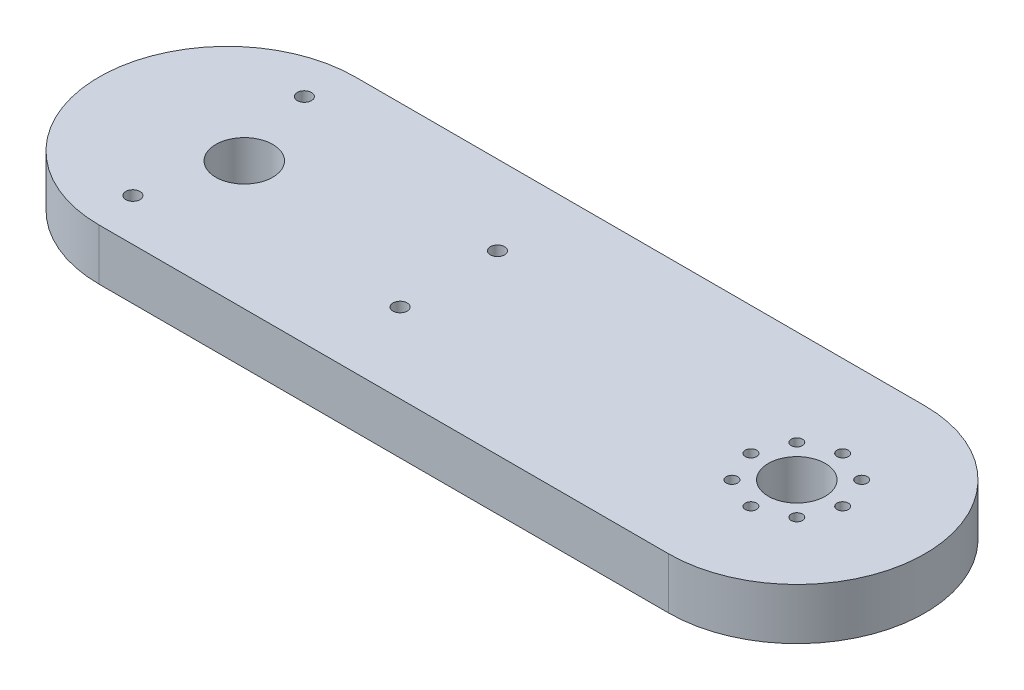
ISO-10303-21;
HEADER;
FILE_DESCRIPTION(('STEP AP214'),'2;1');
FILE_NAME('part.step','',(''),(''),'','','');
FILE_SCHEMA(('AUTOMOTIVE_DESIGN { 1 0 10303 214 1 1 1 1 }'));
ENDSEC;
DATA;
#1=APPLICATION_CONTEXT('core data for automotive mechanical design processes');
#2=APPLICATION_PROTOCOL_DEFINITION('international standard','automotive_design',2000,#1);
#3=PRODUCT_CONTEXT('',#1,'mechanical');
#4=PRODUCT('Part','Part','',(#3));
#5=PRODUCT_RELATED_PRODUCT_CATEGORY('part','',(#4));
#6=PRODUCT_DEFINITION_FORMATION('','',#4);
#7=PRODUCT_DEFINITION_CONTEXT('part definition',#1,'design');
#8=PRODUCT_DEFINITION('design','',#6,#7);
#9=PRODUCT_DEFINITION_SHAPE('','',#8);
#10=(LENGTH_UNIT() NAMED_UNIT(*) SI_UNIT(.MILLI.,.METRE.));
#11=(NAMED_UNIT(*) PLANE_ANGLE_UNIT() SI_UNIT($,.RADIAN.));
#12=(NAMED_UNIT(*) SI_UNIT($,.STERADIAN.) SOLID_ANGLE_UNIT());
#13=UNCERTAINTY_MEASURE_WITH_UNIT(LENGTH_MEASURE(1.E-05),#10,'distance_accuracy_value','');
#14=(GEOMETRIC_REPRESENTATION_CONTEXT(3) GLOBAL_UNCERTAINTY_ASSIGNED_CONTEXT((#13)) GLOBAL_UNIT_ASSIGNED_CONTEXT((#10,
#11,#12)) REPRESENTATION_CONTEXT('',''));
#15=CARTESIAN_POINT('',(0.,0.,0.));
#16=DIRECTION('',(0.,0.,1.));
#17=DIRECTION('',(1.,0.,0.));
#18=AXIS2_PLACEMENT_3D('',#15,#16,#17);
#19=CARTESIAN_POINT('',(50.,4.5,0.));
#20=DIRECTION('',(0.,-1.,0.));
#21=DIRECTION('',(0.,0.,-1.));
#22=AXIS2_PLACEMENT_3D('',#19,#20,#21);
#23=CYLINDRICAL_SURFACE('',#22,22.5);
#24=CARTESIAN_POINT('',(50.,-4.5,0.));
#25=DIRECTION('',(0.,1.,0.));
#26=DIRECTION('',(0.,0.,1.));
#27=AXIS2_PLACEMENT_3D('',#24,#25,#26);
#28=CIRCLE('',#27,22.5);
#29=CARTESIAN_POINT('',(50.,-4.5,22.5));
#30=VERTEX_POINT('',#29);
#31=CARTESIAN_POINT('',(50.,-4.5,-22.5));
#32=VERTEX_POINT('',#31);
#33=EDGE_CURVE('E99',#30,#32,#28,.T.);
#34=ORIENTED_EDGE('',*,*,#33,.T.);
#35=DIRECTION('',(0.,-1.,0.));
#36=VECTOR('',#35,1.);
#37=CARTESIAN_POINT('',(50.,4.5,-22.5));
#38=LINE('',#37,#36);
#39=CARTESIAN_POINT('',(50.,4.5,-22.5));
#40=VERTEX_POINT('',#39);
#41=EDGE_CURVE('E11',#40,#32,#38,.T.);
#42=ORIENTED_EDGE('',*,*,#41,.F.);
#43=CARTESIAN_POINT('',(50.,4.5,0.));
#44=DIRECTION('',(0.,1.,0.));
#45=DIRECTION('',(0.,0.,1.));
#46=AXIS2_PLACEMENT_3D('',#43,#44,#45);
#47=CIRCLE('',#46,22.5);
#48=CARTESIAN_POINT('',(50.,4.5,22.5));
#49=VERTEX_POINT('',#48);
#50=EDGE_CURVE('E87',#49,#40,#47,.T.);
#51=ORIENTED_EDGE('',*,*,#50,.F.);
#52=DIRECTION('',(0.,-1.,0.));
#53=VECTOR('',#52,1.);
#54=CARTESIAN_POINT('',(50.,4.5,22.5));
#55=LINE('',#54,#53);
#56=EDGE_CURVE('E95',#49,#30,#55,.T.);
#57=ORIENTED_EDGE('',*,*,#56,.T.);
#58=EDGE_LOOP('',(#34,#42,#51,#57));
#59=FACE_BOUND('',#58,.T.);
#60=ADVANCED_FACE('F36',(#59),#23,.T.);
#61=CARTESIAN_POINT('',(50.,4.5,-22.5));
#62=DIRECTION('',(0.,0.,1.));
#63=DIRECTION('',(1.,0.,0.));
#64=AXIS2_PLACEMENT_3D('',#61,#62,#63);
#65=PLANE('',#64);
#66=DIRECTION('',(-1.,0.,0.));
#67=VECTOR('',#66,1.);
#68=CARTESIAN_POINT('',(50.,-4.5,-22.5));
#69=LINE('',#68,#67);
#70=CARTESIAN_POINT('',(-50.,-4.5,-22.5));
#71=VERTEX_POINT('',#70);
#72=EDGE_CURVE('E91',#32,#71,#69,.T.);
#73=ORIENTED_EDGE('',*,*,#72,.T.);
#74=DIRECTION('',(0.,-1.,0.));
#75=VECTOR('',#74,1.);
#76=CARTESIAN_POINT('',(-50.,4.5,-22.5));
#77=LINE('',#76,#75);
#78=CARTESIAN_POINT('',(-50.,4.5,-22.5));
#79=VERTEX_POINT('',#78);
#80=EDGE_CURVE('E44',#79,#71,#77,.T.);
#81=ORIENTED_EDGE('',*,*,#80,.F.);
#82=DIRECTION('',(-1.,0.,0.));
#83=VECTOR('',#82,1.);
#84=CARTESIAN_POINT('',(50.,4.5,-22.5));
#85=LINE('',#84,#83);
#86=EDGE_CURVE('E82',#40,#79,#85,.T.);
#87=ORIENTED_EDGE('',*,*,#86,.F.);
#88=ORIENTED_EDGE('',*,*,#41,.T.);
#89=EDGE_LOOP('',(#73,#81,#87,#88));
#90=FACE_BOUND('',#89,.T.);
#91=ADVANCED_FACE('F90',(#90),#65,.F.);
#92=CARTESIAN_POINT('',(-50.,4.5,0.));
#93=DIRECTION('',(0.,-1.,0.));
#94=DIRECTION('',(0.,0.,-1.));
#95=AXIS2_PLACEMENT_3D('',#92,#93,#94);
#96=CYLINDRICAL_SURFACE('',#95,22.5);
#97=CARTESIAN_POINT('',(-50.,-4.5,0.));
#98=DIRECTION('',(0.,1.,0.));
#99=DIRECTION('',(0.,0.,1.));
#100=AXIS2_PLACEMENT_3D('',#97,#98,#99);
#101=CIRCLE('',#100,22.5);
#102=CARTESIAN_POINT('',(-50.,-4.5,22.5));
#103=VERTEX_POINT('',#102);
#104=EDGE_CURVE('E69',#71,#103,#101,.T.);
#105=ORIENTED_EDGE('',*,*,#104,.T.);
#106=DIRECTION('',(0.,-1.,0.));
#107=VECTOR('',#106,1.);
#108=CARTESIAN_POINT('',(-50.,4.5,22.5));
#109=LINE('',#108,#107);
#110=CARTESIAN_POINT('',(-50.,4.5,22.5));
#111=VERTEX_POINT('',#110);
#112=EDGE_CURVE('E92',#111,#103,#109,.T.);
#113=ORIENTED_EDGE('',*,*,#112,.F.);
#114=CARTESIAN_POINT('',(-50.,4.5,0.));
#115=DIRECTION('',(0.,1.,0.));
#116=DIRECTION('',(0.,0.,1.));
#117=AXIS2_PLACEMENT_3D('',#114,#115,#116);
#118=CIRCLE('',#117,22.5);
#119=EDGE_CURVE('E85',#79,#111,#118,.T.);
#120=ORIENTED_EDGE('',*,*,#119,.F.);
#121=ORIENTED_EDGE('',*,*,#80,.T.);
#122=EDGE_LOOP('',(#105,#113,#120,#121));
#123=FACE_BOUND('',#122,.T.);
#124=ADVANCED_FACE('F93',(#123),#96,.T.);
#125=CARTESIAN_POINT('',(50.,4.5,22.5));
#126=DIRECTION('',(0.,0.,-1.));
#127=DIRECTION('',(-1.,0.,0.));
#128=AXIS2_PLACEMENT_3D('',#125,#126,#127);
#129=PLANE('',#128);
#130=DIRECTION('',(1.,0.,0.));
#131=VECTOR('',#130,1.);
#132=CARTESIAN_POINT('',(50.,-4.5,22.5));
#133=LINE('',#132,#131);
#134=EDGE_CURVE('E75',#103,#30,#133,.T.);
#135=ORIENTED_EDGE('',*,*,#134,.T.);
#136=ORIENTED_EDGE('',*,*,#56,.F.);
#137=DIRECTION('',(1.,0.,0.));
#138=VECTOR('',#137,1.);
#139=CARTESIAN_POINT('',(50.,4.5,22.5));
#140=LINE('',#139,#138);
#141=EDGE_CURVE('E52',#111,#49,#140,.T.);
#142=ORIENTED_EDGE('',*,*,#141,.F.);
#143=ORIENTED_EDGE('',*,*,#112,.T.);
#144=EDGE_LOOP('',(#135,#136,#142,#143));
#145=FACE_BOUND('',#144,.T.);
#146=ADVANCED_FACE('F107',(#145),#129,.F.);
#147=CARTESIAN_POINT('',(50.,4.5,0.));
#148=DIRECTION('',(0.,1.,0.));
#149=DIRECTION('',(0.,0.,1.));
#150=AXIS2_PLACEMENT_3D('',#147,#148,#149);
#151=PLANE('',#150);
#152=CARTESIAN_POINT('',(-51.5,4.5,15.05));
#153=DIRECTION('',(0.,1.,0.));
#154=DIRECTION('',(0.,0.,1.));
#155=AXIS2_PLACEMENT_3D('',#152,#153,#154);
#156=CIRCLE('',#155,1.25);
#157=CARTESIAN_POINT('',(-51.5,4.5,16.3));
#158=VERTEX_POINT('',#157);
#159=EDGE_CURVE('E164',#158,#158,#156,.T.);
#160=ORIENTED_EDGE('',*,*,#159,.F.);
#161=EDGE_LOOP('',(#160));
#162=FACE_BOUND('',#161,.T.);
#163=CARTESIAN_POINT('',(-47.,4.5,0.));
#164=DIRECTION('',(0.,1.,0.));
#165=DIRECTION('',(0.,0.,1.));
#166=AXIS2_PLACEMENT_3D('',#163,#164,#165);
#167=CIRCLE('',#166,5.);
#168=CARTESIAN_POINT('',(-47.,4.5,5.));
#169=VERTEX_POINT('',#168);
#170=EDGE_CURVE('E169',#169,#169,#167,.T.);
#171=ORIENTED_EDGE('',*,*,#170,.F.);
#172=EDGE_LOOP('',(#171));
#173=FACE_BOUND('',#172,.T.);
#174=CARTESIAN_POINT('',(-11.1,4.5,-8.55));
#175=DIRECTION('',(0.,1.,0.));
#176=DIRECTION('',(0.,0.,1.));
#177=AXIS2_PLACEMENT_3D('',#174,#175,#176);
#178=CIRCLE('',#177,1.25);
#179=CARTESIAN_POINT('',(-11.1,4.5,-7.3));
#180=VERTEX_POINT('',#179);
#181=EDGE_CURVE('E172',#180,#180,#178,.T.);
#182=ORIENTED_EDGE('',*,*,#181,.F.);
#183=EDGE_LOOP('',(#182));
#184=FACE_BOUND('',#183,.T.);
#185=CARTESIAN_POINT('',(-11.1,4.5,8.55));
#186=DIRECTION('',(0.,1.,0.));
#187=DIRECTION('',(0.,0.,1.));
#188=AXIS2_PLACEMENT_3D('',#185,#186,#187);
#189=CIRCLE('',#188,1.25);
#190=CARTESIAN_POINT('',(-11.1,4.5,9.8));
#191=VERTEX_POINT('',#190);
#192=EDGE_CURVE('E175',#191,#191,#189,.T.);
#193=ORIENTED_EDGE('',*,*,#192,.F.);
#194=EDGE_LOOP('',(#193));
#195=FACE_BOUND('',#194,.T.);
#196=CARTESIAN_POINT('',(-51.5,4.5,-15.05));
#197=DIRECTION('',(0.,1.,0.));
#198=DIRECTION('',(0.,0.,1.));
#199=AXIS2_PLACEMENT_3D('',#196,#197,#198);
#200=CIRCLE('',#199,1.25);
#201=CARTESIAN_POINT('',(-51.5,4.5,-13.8));
#202=VERTEX_POINT('',#201);
#203=EDGE_CURVE('E178',#202,#202,#200,.T.);
#204=ORIENTED_EDGE('',*,*,#203,.F.);
#205=EDGE_LOOP('',(#204));
#206=FACE_BOUND('',#205,.T.);
#207=CARTESIAN_POINT('',(50.,4.5,0.));
#208=DIRECTION('',(0.,1.,0.));
#209=DIRECTION('',(0.,0.,1.));
#210=AXIS2_PLACEMENT_3D('',#207,#208,#209);
#211=CIRCLE('',#210,5.);
#212=CARTESIAN_POINT('',(50.,4.5,4.99999999999998));
#213=VERTEX_POINT('',#212);
#214=EDGE_CURVE('E161',#213,#213,#211,.T.);
#215=ORIENTED_EDGE('',*,*,#214,.F.);
#216=EDGE_LOOP('',(#215));
#217=FACE_BOUND('',#216,.T.);
#218=CARTESIAN_POINT('',(41.95,4.5,0.));
#219=DIRECTION('',(0.,1.,0.));
#220=DIRECTION('',(0.,0.,1.));
#221=AXIS2_PLACEMENT_3D('',#218,#219,#220);
#222=CIRCLE('',#221,0.989999999999994);
#223=CARTESIAN_POINT('',(41.95,4.5,0.989999999999994));
#224=VERTEX_POINT('',#223);
#225=EDGE_CURVE('E102',#224,#224,#222,.T.);
#226=ORIENTED_EDGE('',*,*,#225,.F.);
#227=EDGE_LOOP('',(#226));
#228=FACE_BOUND('',#227,.T.);
#229=CARTESIAN_POINT('',(44.3077904114483,4.5,-5.69220958855171));
#230=DIRECTION('',(0.,1.,0.));
#231=DIRECTION('',(0.,0.,1.));
#232=AXIS2_PLACEMENT_3D('',#229,#230,#231);
#233=CIRCLE('',#232,0.989999999999994);
#234=CARTESIAN_POINT('',(44.3077904114483,4.5,-4.70220958855171));
#235=VERTEX_POINT('',#234);
#236=EDGE_CURVE('E115',#235,#235,#233,.T.);
#237=ORIENTED_EDGE('',*,*,#236,.F.);
#238=EDGE_LOOP('',(#237));
#239=FACE_BOUND('',#238,.T.);
#240=CARTESIAN_POINT('',(50.,4.5,-8.05));
#241=DIRECTION('',(0.,1.,0.));
#242=DIRECTION('',(0.,0.,1.));
#243=AXIS2_PLACEMENT_3D('',#240,#241,#242);
#244=CIRCLE('',#243,0.989999999999994);
#245=CARTESIAN_POINT('',(50.,4.5,-7.06000000000001));
#246=VERTEX_POINT('',#245);
#247=EDGE_CURVE('E118',#246,#246,#244,.T.);
#248=ORIENTED_EDGE('',*,*,#247,.F.);
#249=EDGE_LOOP('',(#248));
#250=FACE_BOUND('',#249,.T.);
#251=CARTESIAN_POINT('',(55.6922095885517,4.5,-5.69220958855171));
#252=DIRECTION('',(0.,1.,0.));
#253=DIRECTION('',(0.,0.,1.));
#254=AXIS2_PLACEMENT_3D('',#251,#252,#253);
#255=CIRCLE('',#254,0.989999999999994);
#256=CARTESIAN_POINT('',(55.6922095885517,4.5,-4.70220958855172));
#257=VERTEX_POINT('',#256);
#258=EDGE_CURVE('E121',#257,#257,#255,.T.);
#259=ORIENTED_EDGE('',*,*,#258,.F.);
#260=EDGE_LOOP('',(#259));
#261=FACE_BOUND('',#260,.T.);
#262=CARTESIAN_POINT('',(58.05,4.5,0.));
#263=DIRECTION('',(0.,1.,0.));
#264=DIRECTION('',(0.,0.,1.));
#265=AXIS2_PLACEMENT_3D('',#262,#263,#264);
#266=CIRCLE('',#265,0.989999999999994);
#267=CARTESIAN_POINT('',(58.05,4.5,0.989999999999991));
#268=VERTEX_POINT('',#267);
#269=EDGE_CURVE('E124',#268,#268,#266,.T.);
#270=ORIENTED_EDGE('',*,*,#269,.F.);
#271=EDGE_LOOP('',(#270));
#272=FACE_BOUND('',#271,.T.);
#273=CARTESIAN_POINT('',(55.6922095885517,4.5,5.69220958855171));
#274=DIRECTION('',(0.,1.,0.));
#275=DIRECTION('',(0.,0.,1.));
#276=AXIS2_PLACEMENT_3D('',#273,#274,#275);
#277=CIRCLE('',#276,0.990000000000001);
#278=CARTESIAN_POINT('',(55.6922095885517,4.5,6.68220958855171));
#279=VERTEX_POINT('',#278);
#280=EDGE_CURVE('E127',#279,#279,#277,.T.);
#281=ORIENTED_EDGE('',*,*,#280,.F.);
#282=EDGE_LOOP('',(#281));
#283=FACE_BOUND('',#282,.T.);
#284=CARTESIAN_POINT('',(50.,4.5,8.05));
#285=DIRECTION('',(0.,1.,0.));
#286=DIRECTION('',(0.,0.,1.));
#287=AXIS2_PLACEMENT_3D('',#284,#285,#286);
#288=CIRCLE('',#287,0.989999999999994);
#289=CARTESIAN_POINT('',(50.,4.5,9.04));
#290=VERTEX_POINT('',#289);
#291=EDGE_CURVE('E130',#290,#290,#288,.T.);
#292=ORIENTED_EDGE('',*,*,#291,.F.);
#293=EDGE_LOOP('',(#292));
#294=FACE_BOUND('',#293,.T.);
#295=CARTESIAN_POINT('',(44.3077904114483,4.5,5.69220958855171));
#296=DIRECTION('',(0.,1.,0.));
#297=DIRECTION('',(0.,0.,1.));
#298=AXIS2_PLACEMENT_3D('',#295,#296,#297);
#299=CIRCLE('',#298,0.989999999999994);
#300=CARTESIAN_POINT('',(44.3077904114483,4.5,6.6822095885517));
#301=VERTEX_POINT('',#300);
#302=EDGE_CURVE('E133',#301,#301,#299,.T.);
#303=ORIENTED_EDGE('',*,*,#302,.F.);
#304=EDGE_LOOP('',(#303));
#305=FACE_BOUND('',#304,.T.);
#306=ORIENTED_EDGE('',*,*,#50,.T.);
#307=ORIENTED_EDGE('',*,*,#86,.T.);
#308=ORIENTED_EDGE('',*,*,#119,.T.);
#309=ORIENTED_EDGE('',*,*,#141,.T.);
#310=EDGE_LOOP('',(#306,#307,#308,#309));
#311=FACE_BOUND('',#310,.T.);
#312=ADVANCED_FACE('F83',(#162,#173,#184,#195,#206,#217,#228,#239,#250,#261,#272,#283,#294,#305,
#311),#151,.T.);
#313=CARTESIAN_POINT('',(50.,-4.5,0.));
#314=DIRECTION('',(0.,1.,0.));
#315=DIRECTION('',(0.,0.,1.));
#316=AXIS2_PLACEMENT_3D('',#313,#314,#315);
#317=PLANE('',#316);
#318=CARTESIAN_POINT('',(-51.5,-4.5,15.05));
#319=DIRECTION('',(0.,1.,0.));
#320=DIRECTION('',(0.,0.,1.));
#321=AXIS2_PLACEMENT_3D('',#318,#319,#320);
#322=CIRCLE('',#321,1.25);
#323=CARTESIAN_POINT('',(-51.5,-4.5,16.3));
#324=VERTEX_POINT('',#323);
#325=EDGE_CURVE('E181',#324,#324,#322,.T.);
#326=ORIENTED_EDGE('',*,*,#325,.T.);
#327=EDGE_LOOP('',(#326));
#328=FACE_BOUND('',#327,.T.);
#329=CARTESIAN_POINT('',(-47.,-4.5,0.));
#330=DIRECTION('',(0.,1.,0.));
#331=DIRECTION('',(0.,0.,1.));
#332=AXIS2_PLACEMENT_3D('',#329,#330,#331);
#333=CIRCLE('',#332,5.);
#334=CARTESIAN_POINT('',(-47.,-4.5,5.));
#335=VERTEX_POINT('',#334);
#336=EDGE_CURVE('E189',#335,#335,#333,.T.);
#337=ORIENTED_EDGE('',*,*,#336,.T.);
#338=EDGE_LOOP('',(#337));
#339=FACE_BOUND('',#338,.T.);
#340=CARTESIAN_POINT('',(-11.1,-4.5,-8.55));
#341=DIRECTION('',(0.,1.,0.));
#342=DIRECTION('',(0.,0.,1.));
#343=AXIS2_PLACEMENT_3D('',#340,#341,#342);
#344=CIRCLE('',#343,1.25);
#345=CARTESIAN_POINT('',(-11.1,-4.5,-7.3));
#346=VERTEX_POINT('',#345);
#347=EDGE_CURVE('E186',#346,#346,#344,.T.);
#348=ORIENTED_EDGE('',*,*,#347,.T.);
#349=EDGE_LOOP('',(#348));
#350=FACE_BOUND('',#349,.T.);
#351=CARTESIAN_POINT('',(-11.1,-4.5,8.55));
#352=DIRECTION('',(0.,1.,0.));
#353=DIRECTION('',(0.,0.,-1.));
#354=AXIS2_PLACEMENT_3D('',#351,#352,#353);
#355=CIRCLE('',#354,1.25);
#356=CARTESIAN_POINT('',(-11.1,-4.5,7.30000000000001));
#357=VERTEX_POINT('',#356);
#358=EDGE_CURVE('E182',#357,#357,#355,.T.);
#359=ORIENTED_EDGE('',*,*,#358,.T.);
#360=EDGE_LOOP('',(#359));
#361=FACE_BOUND('',#360,.T.);
#362=CARTESIAN_POINT('',(-51.5,-4.5,-15.05));
#363=DIRECTION('',(0.,1.,0.));
#364=DIRECTION('',(0.,0.,1.));
#365=AXIS2_PLACEMENT_3D('',#362,#363,#364);
#366=CIRCLE('',#365,1.25);
#367=CARTESIAN_POINT('',(-51.5,-4.5,-13.8));
#368=VERTEX_POINT('',#367);
#369=EDGE_CURVE('E185',#368,#368,#366,.T.);
#370=ORIENTED_EDGE('',*,*,#369,.T.);
#371=EDGE_LOOP('',(#370));
#372=FACE_BOUND('',#371,.T.);
#373=CARTESIAN_POINT('',(50.,-4.5,0.));
#374=DIRECTION('',(0.,1.,0.));
#375=DIRECTION('',(0.,0.,1.));
#376=AXIS2_PLACEMENT_3D('',#373,#374,#375);
#377=CIRCLE('',#376,5.);
#378=CARTESIAN_POINT('',(50.,-4.5,4.99999999999998));
#379=VERTEX_POINT('',#378);
#380=EDGE_CURVE('E141',#379,#379,#377,.T.);
#381=ORIENTED_EDGE('',*,*,#380,.T.);
#382=EDGE_LOOP('',(#381));
#383=FACE_BOUND('',#382,.T.);
#384=CARTESIAN_POINT('',(41.95,-4.5,0.));
#385=DIRECTION('',(0.,1.,0.));
#386=DIRECTION('',(0.,0.,1.));
#387=AXIS2_PLACEMENT_3D('',#384,#385,#386);
#388=CIRCLE('',#387,0.989999999999994);
#389=CARTESIAN_POINT('',(41.95,-4.5,0.989999999999994));
#390=VERTEX_POINT('',#389);
#391=EDGE_CURVE('E136',#390,#390,#388,.T.);
#392=ORIENTED_EDGE('',*,*,#391,.T.);
#393=EDGE_LOOP('',(#392));
#394=FACE_BOUND('',#393,.T.);
#395=CARTESIAN_POINT('',(44.3077904114483,-4.5,-5.69220958855171));
#396=DIRECTION('',(0.,1.,0.));
#397=DIRECTION('',(0.,0.,1.));
#398=AXIS2_PLACEMENT_3D('',#395,#396,#397);
#399=CIRCLE('',#398,0.989999999999994);
#400=CARTESIAN_POINT('',(44.3077904114483,-4.5,-4.70220958855171));
#401=VERTEX_POINT('',#400);
#402=EDGE_CURVE('E156',#401,#401,#399,.T.);
#403=ORIENTED_EDGE('',*,*,#402,.T.);
#404=EDGE_LOOP('',(#403));
#405=FACE_BOUND('',#404,.T.);
#406=CARTESIAN_POINT('',(50.,-4.5,-8.05));
#407=DIRECTION('',(0.,1.,0.));
#408=DIRECTION('',(0.,0.,1.));
#409=AXIS2_PLACEMENT_3D('',#406,#407,#408);
#410=CIRCLE('',#409,0.989999999999994);
#411=CARTESIAN_POINT('',(50.,-4.5,-7.06000000000001));
#412=VERTEX_POINT('',#411);
#413=EDGE_CURVE('E153',#412,#412,#410,.T.);
#414=ORIENTED_EDGE('',*,*,#413,.T.);
#415=EDGE_LOOP('',(#414));
#416=FACE_BOUND('',#415,.T.);
#417=CARTESIAN_POINT('',(55.6922095885517,-4.5,-5.69220958855171));
#418=DIRECTION('',(0.,1.,0.));
#419=DIRECTION('',(0.,0.,1.));
#420=AXIS2_PLACEMENT_3D('',#417,#418,#419);
#421=CIRCLE('',#420,0.989999999999994);
#422=CARTESIAN_POINT('',(55.6922095885517,-4.5,-4.70220958855172));
#423=VERTEX_POINT('',#422);
#424=EDGE_CURVE('E150',#423,#423,#421,.T.);
#425=ORIENTED_EDGE('',*,*,#424,.T.);
#426=EDGE_LOOP('',(#425));
#427=FACE_BOUND('',#426,.T.);
#428=CARTESIAN_POINT('',(58.05,-4.5,0.));
#429=DIRECTION('',(0.,1.,0.));
#430=DIRECTION('',(0.,0.,1.));
#431=AXIS2_PLACEMENT_3D('',#428,#429,#430);
#432=CIRCLE('',#431,0.989999999999994);
#433=CARTESIAN_POINT('',(58.05,-4.5,0.989999999999991));
#434=VERTEX_POINT('',#433);
#435=EDGE_CURVE('E147',#434,#434,#432,.T.);
#436=ORIENTED_EDGE('',*,*,#435,.T.);
#437=EDGE_LOOP('',(#436));
#438=FACE_BOUND('',#437,.T.);
#439=CARTESIAN_POINT('',(55.6922095885517,-4.5,5.69220958855171));
#440=DIRECTION('',(0.,1.,0.));
#441=DIRECTION('',(0.,0.,1.));
#442=AXIS2_PLACEMENT_3D('',#439,#440,#441);
#443=CIRCLE('',#442,0.990000000000001);
#444=CARTESIAN_POINT('',(55.6922095885517,-4.5,6.68220958855171));
#445=VERTEX_POINT('',#444);
#446=EDGE_CURVE('E144',#445,#445,#443,.T.);
#447=ORIENTED_EDGE('',*,*,#446,.T.);
#448=EDGE_LOOP('',(#447));
#449=FACE_BOUND('',#448,.T.);
#450=CARTESIAN_POINT('',(50.,-4.5,8.05));
#451=DIRECTION('',(0.,1.,0.));
#452=DIRECTION('',(0.,0.,1.));
#453=AXIS2_PLACEMENT_3D('',#450,#451,#452);
#454=CIRCLE('',#453,0.989999999999994);
#455=CARTESIAN_POINT('',(50.,-4.5,9.04));
#456=VERTEX_POINT('',#455);
#457=EDGE_CURVE('E140',#456,#456,#454,.T.);
#458=ORIENTED_EDGE('',*,*,#457,.T.);
#459=EDGE_LOOP('',(#458));
#460=FACE_BOUND('',#459,.T.);
#461=CARTESIAN_POINT('',(44.3077904114483,-4.5,5.69220958855171));
#462=DIRECTION('',(0.,1.,0.));
#463=DIRECTION('',(0.,0.,1.));
#464=AXIS2_PLACEMENT_3D('',#461,#462,#463);
#465=CIRCLE('',#464,0.989999999999994);
#466=CARTESIAN_POINT('',(44.3077904114483,-4.5,6.6822095885517));
#467=VERTEX_POINT('',#466);
#468=EDGE_CURVE('E137',#467,#467,#465,.T.);
#469=ORIENTED_EDGE('',*,*,#468,.T.);
#470=EDGE_LOOP('',(#469));
#471=FACE_BOUND('',#470,.T.);
#472=ORIENTED_EDGE('',*,*,#33,.F.);
#473=ORIENTED_EDGE('',*,*,#134,.F.);
#474=ORIENTED_EDGE('',*,*,#104,.F.);
#475=ORIENTED_EDGE('',*,*,#72,.F.);
#476=EDGE_LOOP('',(#472,#473,#474,#475));
#477=FACE_BOUND('',#476,.T.);
#478=ADVANCED_FACE('F110',(#328,#339,#350,#361,#372,#383,#394,#405,#416,#427,#438,#449,#460,
#471,#477),#317,.F.);
#479=CARTESIAN_POINT('',(44.3077904114483,-4.5,5.69220958855171));
#480=DIRECTION('',(0.,1.,0.));
#481=DIRECTION('',(0.,0.,1.));
#482=AXIS2_PLACEMENT_3D('',#479,#480,#481);
#483=CYLINDRICAL_SURFACE('',#482,0.989999999999994);
#484=ORIENTED_EDGE('',*,*,#302,.T.);
#485=EDGE_LOOP('',(#484));
#486=FACE_BOUND('',#485,.T.);
#487=ORIENTED_EDGE('',*,*,#468,.F.);
#488=EDGE_LOOP('',(#487));
#489=FACE_BOUND('',#488,.T.);
#490=ADVANCED_FACE('F224',(#486,#489),#483,.F.);
#491=CARTESIAN_POINT('',(50.,-4.5,8.05));
#492=DIRECTION('',(0.,1.,0.));
#493=DIRECTION('',(0.,0.,1.));
#494=AXIS2_PLACEMENT_3D('',#491,#492,#493);
#495=CYLINDRICAL_SURFACE('',#494,0.989999999999994);
#496=ORIENTED_EDGE('',*,*,#291,.T.);
#497=EDGE_LOOP('',(#496));
#498=FACE_BOUND('',#497,.T.);
#499=ORIENTED_EDGE('',*,*,#457,.F.);
#500=EDGE_LOOP('',(#499));
#501=FACE_BOUND('',#500,.T.);
#502=ADVANCED_FACE('F230',(#498,#501),#495,.F.);
#503=CARTESIAN_POINT('',(55.6922095885517,-4.5,5.69220958855171));
#504=DIRECTION('',(0.,1.,0.));
#505=DIRECTION('',(0.,0.,1.));
#506=AXIS2_PLACEMENT_3D('',#503,#504,#505);
#507=CYLINDRICAL_SURFACE('',#506,0.990000000000001);
#508=ORIENTED_EDGE('',*,*,#280,.T.);
#509=EDGE_LOOP('',(#508));
#510=FACE_BOUND('',#509,.T.);
#511=ORIENTED_EDGE('',*,*,#446,.F.);
#512=EDGE_LOOP('',(#511));
#513=FACE_BOUND('',#512,.T.);
#514=ADVANCED_FACE('F234',(#510,#513),#507,.F.);
#515=CARTESIAN_POINT('',(58.05,-4.5,0.));
#516=DIRECTION('',(0.,1.,0.));
#517=DIRECTION('',(0.,0.,1.));
#518=AXIS2_PLACEMENT_3D('',#515,#516,#517);
#519=CYLINDRICAL_SURFACE('',#518,0.989999999999994);
#520=ORIENTED_EDGE('',*,*,#269,.T.);
#521=EDGE_LOOP('',(#520));
#522=FACE_BOUND('',#521,.T.);
#523=ORIENTED_EDGE('',*,*,#435,.F.);
#524=EDGE_LOOP('',(#523));
#525=FACE_BOUND('',#524,.T.);
#526=ADVANCED_FACE('F238',(#522,#525),#519,.F.);
#527=CARTESIAN_POINT('',(55.6922095885517,-4.5,-5.69220958855171));
#528=DIRECTION('',(0.,1.,0.));
#529=DIRECTION('',(0.,0.,1.));
#530=AXIS2_PLACEMENT_3D('',#527,#528,#529);
#531=CYLINDRICAL_SURFACE('',#530,0.989999999999994);
#532=ORIENTED_EDGE('',*,*,#258,.T.);
#533=EDGE_LOOP('',(#532));
#534=FACE_BOUND('',#533,.T.);
#535=ORIENTED_EDGE('',*,*,#424,.F.);
#536=EDGE_LOOP('',(#535));
#537=FACE_BOUND('',#536,.T.);
#538=ADVANCED_FACE('F242',(#534,#537),#531,.F.);
#539=CARTESIAN_POINT('',(50.,-4.5,-8.05));
#540=DIRECTION('',(0.,1.,0.));
#541=DIRECTION('',(0.,0.,1.));
#542=AXIS2_PLACEMENT_3D('',#539,#540,#541);
#543=CYLINDRICAL_SURFACE('',#542,0.989999999999994);
#544=ORIENTED_EDGE('',*,*,#247,.T.);
#545=EDGE_LOOP('',(#544));
#546=FACE_BOUND('',#545,.T.);
#547=ORIENTED_EDGE('',*,*,#413,.F.);
#548=EDGE_LOOP('',(#547));
#549=FACE_BOUND('',#548,.T.);
#550=ADVANCED_FACE('F246',(#546,#549),#543,.F.);
#551=CARTESIAN_POINT('',(44.3077904114483,-4.5,-5.69220958855171));
#552=DIRECTION('',(0.,1.,0.));
#553=DIRECTION('',(0.,0.,1.));
#554=AXIS2_PLACEMENT_3D('',#551,#552,#553);
#555=CYLINDRICAL_SURFACE('',#554,0.989999999999994);
#556=ORIENTED_EDGE('',*,*,#236,.T.);
#557=EDGE_LOOP('',(#556));
#558=FACE_BOUND('',#557,.T.);
#559=ORIENTED_EDGE('',*,*,#402,.F.);
#560=EDGE_LOOP('',(#559));
#561=FACE_BOUND('',#560,.T.);
#562=ADVANCED_FACE('F250',(#558,#561),#555,.F.);
#563=CARTESIAN_POINT('',(41.95,-4.5,0.));
#564=DIRECTION('',(0.,1.,0.));
#565=DIRECTION('',(0.,0.,1.));
#566=AXIS2_PLACEMENT_3D('',#563,#564,#565);
#567=CYLINDRICAL_SURFACE('',#566,0.989999999999994);
#568=ORIENTED_EDGE('',*,*,#225,.T.);
#569=EDGE_LOOP('',(#568));
#570=FACE_BOUND('',#569,.T.);
#571=ORIENTED_EDGE('',*,*,#391,.F.);
#572=EDGE_LOOP('',(#571));
#573=FACE_BOUND('',#572,.T.);
#574=ADVANCED_FACE('F254',(#570,#573),#567,.F.);
#575=CARTESIAN_POINT('',(50.,-4.5,0.));
#576=DIRECTION('',(0.,1.,0.));
#577=DIRECTION('',(0.,0.,1.));
#578=AXIS2_PLACEMENT_3D('',#575,#576,#577);
#579=CYLINDRICAL_SURFACE('',#578,5.);
#580=ORIENTED_EDGE('',*,*,#380,.F.);
#581=EDGE_LOOP('',(#580));
#582=FACE_BOUND('',#581,.T.);
#583=ORIENTED_EDGE('',*,*,#214,.T.);
#584=EDGE_LOOP('',(#583));
#585=FACE_BOUND('',#584,.T.);
#586=ADVANCED_FACE('F258',(#582,#585),#579,.F.);
#587=CARTESIAN_POINT('',(-51.5,-4.5,-15.05));
#588=DIRECTION('',(0.,1.,0.));
#589=DIRECTION('',(0.,0.,1.));
#590=AXIS2_PLACEMENT_3D('',#587,#588,#589);
#591=CYLINDRICAL_SURFACE('',#590,1.25);
#592=ORIENTED_EDGE('',*,*,#203,.T.);
#593=EDGE_LOOP('',(#592));
#594=FACE_BOUND('',#593,.T.);
#595=ORIENTED_EDGE('',*,*,#369,.F.);
#596=EDGE_LOOP('',(#595));
#597=FACE_BOUND('',#596,.T.);
#598=ADVANCED_FACE('F262',(#594,#597),#591,.F.);
#599=CARTESIAN_POINT('',(-11.1,-4.5,8.55));
#600=DIRECTION('',(0.,1.,0.));
#601=DIRECTION('',(0.,0.,1.));
#602=AXIS2_PLACEMENT_3D('',#599,#600,#601);
#603=CYLINDRICAL_SURFACE('',#602,1.25);
#604=ORIENTED_EDGE('',*,*,#192,.T.);
#605=EDGE_LOOP('',(#604));
#606=FACE_BOUND('',#605,.T.);
#607=ORIENTED_EDGE('',*,*,#358,.F.);
#608=EDGE_LOOP('',(#607));
#609=FACE_BOUND('',#608,.T.);
#610=ADVANCED_FACE('F264',(#606,#609),#603,.F.);
#611=CARTESIAN_POINT('',(-11.1,-4.5,-8.55));
#612=DIRECTION('',(0.,1.,0.));
#613=DIRECTION('',(0.,0.,1.));
#614=AXIS2_PLACEMENT_3D('',#611,#612,#613);
#615=CYLINDRICAL_SURFACE('',#614,1.25);
#616=ORIENTED_EDGE('',*,*,#181,.T.);
#617=EDGE_LOOP('',(#616));
#618=FACE_BOUND('',#617,.T.);
#619=ORIENTED_EDGE('',*,*,#347,.F.);
#620=EDGE_LOOP('',(#619));
#621=FACE_BOUND('',#620,.T.);
#622=ADVANCED_FACE('F207',(#618,#621),#615,.F.);
#623=CARTESIAN_POINT('',(-47.,-4.5,0.));
#624=DIRECTION('',(0.,1.,0.));
#625=DIRECTION('',(0.,0.,1.));
#626=AXIS2_PLACEMENT_3D('',#623,#624,#625);
#627=CYLINDRICAL_SURFACE('',#626,5.);
#628=ORIENTED_EDGE('',*,*,#170,.T.);
#629=EDGE_LOOP('',(#628));
#630=FACE_BOUND('',#629,.T.);
#631=ORIENTED_EDGE('',*,*,#336,.F.);
#632=EDGE_LOOP('',(#631));
#633=FACE_BOUND('',#632,.T.);
#634=ADVANCED_FACE('F201',(#630,#633),#627,.F.);
#635=CARTESIAN_POINT('',(-51.5,-4.5,15.05));
#636=DIRECTION('',(0.,1.,0.));
#637=DIRECTION('',(0.,0.,1.));
#638=AXIS2_PLACEMENT_3D('',#635,#636,#637);
#639=CYLINDRICAL_SURFACE('',#638,1.25);
#640=ORIENTED_EDGE('',*,*,#159,.T.);
#641=EDGE_LOOP('',(#640));
#642=FACE_BOUND('',#641,.T.);
#643=ORIENTED_EDGE('',*,*,#325,.F.);
#644=EDGE_LOOP('',(#643));
#645=FACE_BOUND('',#644,.T.);
#646=ADVANCED_FACE('F199',(#642,#645),#639,.F.);
#647=CLOSED_SHELL('',(#60,#91,#124,#146,#312,#478,#490,#502,#514,#526,#538,#550,#562,#574,#586,
#598,#610,#622,#634,#646));
#648=MANIFOLD_SOLID_BREP('B2',#647);
#649=ADVANCED_BREP_SHAPE_REPRESENTATION('',(#18,#648),#14);
#650=SHAPE_DEFINITION_REPRESENTATION(#9,#649);
ENDSEC;
END-ISO-10303-21;
